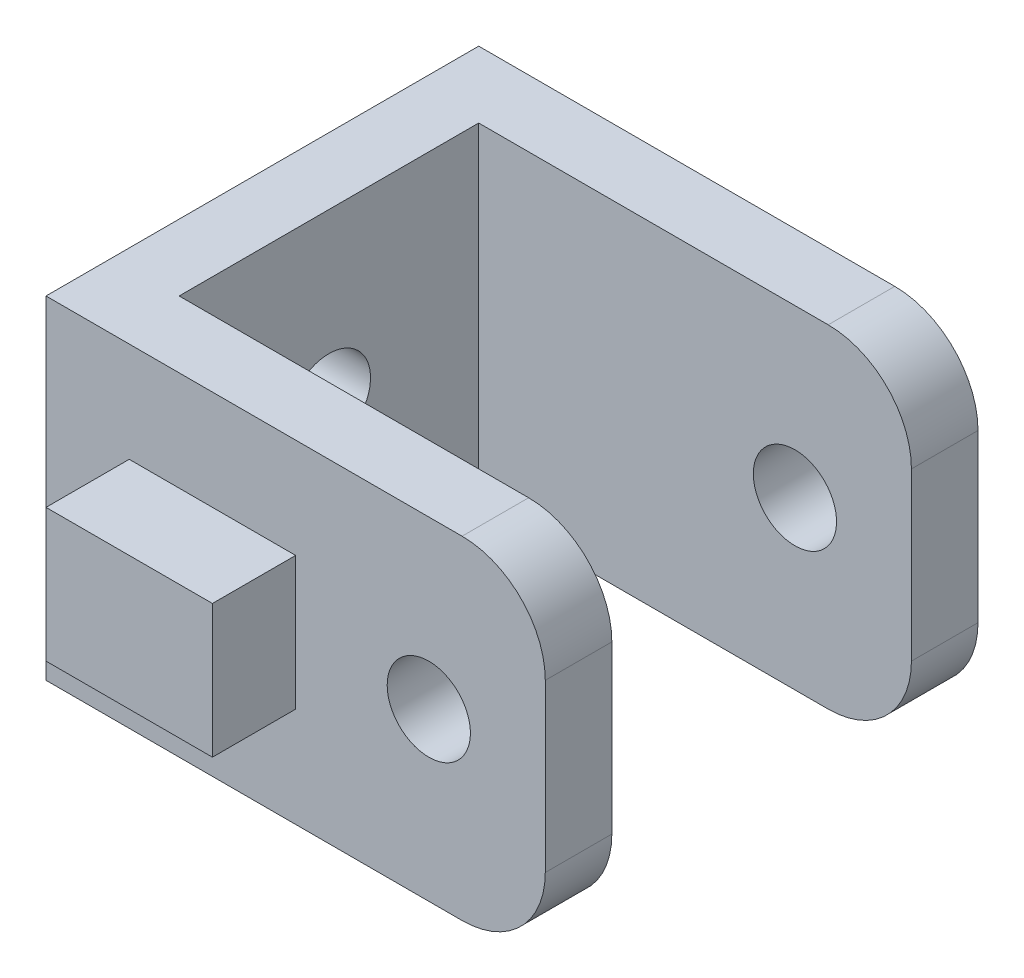
ISO-10303-21;
HEADER;
FILE_DESCRIPTION(('STEP AP214'),'2;1');
FILE_NAME('part.step','',(''),(''),'','','');
FILE_SCHEMA(('AUTOMOTIVE_DESIGN { 1 0 10303 214 1 1 1 1 }'));
ENDSEC;
DATA;
#1=APPLICATION_CONTEXT('core data for automotive mechanical design processes');
#2=APPLICATION_PROTOCOL_DEFINITION('international standard','automotive_design',2000,#1);
#3=PRODUCT_CONTEXT('',#1,'mechanical');
#4=PRODUCT('Part','Part','',(#3));
#5=PRODUCT_RELATED_PRODUCT_CATEGORY('part','',(#4));
#6=PRODUCT_DEFINITION_FORMATION('','',#4);
#7=PRODUCT_DEFINITION_CONTEXT('part definition',#1,'design');
#8=PRODUCT_DEFINITION('design','',#6,#7);
#9=PRODUCT_DEFINITION_SHAPE('','',#8);
#10=(LENGTH_UNIT() NAMED_UNIT(*) SI_UNIT(.MILLI.,.METRE.));
#11=(NAMED_UNIT(*) PLANE_ANGLE_UNIT() SI_UNIT($,.RADIAN.));
#12=(NAMED_UNIT(*) SI_UNIT($,.STERADIAN.) SOLID_ANGLE_UNIT());
#13=UNCERTAINTY_MEASURE_WITH_UNIT(LENGTH_MEASURE(1.E-05),#10,'distance_accuracy_value','');
#14=(GEOMETRIC_REPRESENTATION_CONTEXT(3) GLOBAL_UNCERTAINTY_ASSIGNED_CONTEXT((#13)) GLOBAL_UNIT_ASSIGNED_CONTEXT((#10,
#11,#12)) REPRESENTATION_CONTEXT('',''));
#15=CARTESIAN_POINT('',(0.,0.,0.));
#16=DIRECTION('',(0.,0.,1.));
#17=DIRECTION('',(1.,0.,0.));
#18=AXIS2_PLACEMENT_3D('',#15,#16,#17);
#19=CARTESIAN_POINT('',(0.,10.,-13.));
#20=DIRECTION('',(0.,0.,-1.));
#21=DIRECTION('',(-1.,0.,0.));
#22=AXIS2_PLACEMENT_3D('',#19,#20,#21);
#23=PLANE('',#22);
#24=CARTESIAN_POINT('',(23.,0.,-13.));
#25=DIRECTION('',(0.,0.,-1.));
#26=DIRECTION('',(-1.,0.,0.));
#27=AXIS2_PLACEMENT_3D('',#24,#25,#26);
#28=CIRCLE('',#27,2.5);
#29=CARTESIAN_POINT('',(20.5,0.,-13.));
#30=VERTEX_POINT('',#29);
#31=EDGE_CURVE('E200',#30,#30,#28,.F.);
#32=ORIENTED_EDGE('',*,*,#31,.T.);
#33=EDGE_LOOP('',(#32));
#34=FACE_BOUND('',#33,.T.);
#35=DIRECTION('',(0.,-1.,0.));
#36=VECTOR('',#35,1.);
#37=CARTESIAN_POINT('',(30.,10.,-13.));
#38=LINE('',#37,#36);
#39=CARTESIAN_POINT('',(30.,5.,-13.));
#40=VERTEX_POINT('',#39);
#41=CARTESIAN_POINT('',(30.,-5.,-13.));
#42=VERTEX_POINT('',#41);
#43=EDGE_CURVE('E286',#40,#42,#38,.T.);
#44=ORIENTED_EDGE('',*,*,#43,.T.);
#45=CARTESIAN_POINT('',(25.,-5.,-13.));
#46=DIRECTION('',(0.,0.,-1.));
#47=DIRECTION('',(-1.,0.,0.));
#48=AXIS2_PLACEMENT_3D('',#45,#46,#47);
#49=CIRCLE('',#48,5.);
#50=CARTESIAN_POINT('',(25.,-10.,-13.));
#51=VERTEX_POINT('',#50);
#52=EDGE_CURVE('E307',#42,#51,#49,.T.);
#53=ORIENTED_EDGE('',*,*,#52,.T.);
#54=DIRECTION('',(1.,0.,0.));
#55=VECTOR('',#54,1.);
#56=CARTESIAN_POINT('',(0.,-10.,-13.));
#57=LINE('',#56,#55);
#58=CARTESIAN_POINT('',(0.,-10.,-13.));
#59=VERTEX_POINT('',#58);
#60=EDGE_CURVE('E272',#59,#51,#57,.T.);
#61=ORIENTED_EDGE('',*,*,#60,.F.);
#62=DIRECTION('',(0.,-1.,0.));
#63=VECTOR('',#62,1.);
#64=CARTESIAN_POINT('',(0.,10.,-13.));
#65=LINE('',#64,#63);
#66=CARTESIAN_POINT('',(0.,10.,-13.));
#67=VERTEX_POINT('',#66);
#68=EDGE_CURVE('E284',#67,#59,#65,.T.);
#69=ORIENTED_EDGE('',*,*,#68,.F.);
#70=DIRECTION('',(1.,0.,0.));
#71=VECTOR('',#70,1.);
#72=CARTESIAN_POINT('',(0.,10.,-13.));
#73=LINE('',#72,#71);
#74=CARTESIAN_POINT('',(25.,10.,-13.));
#75=VERTEX_POINT('',#74);
#76=EDGE_CURVE('E256',#67,#75,#73,.T.);
#77=ORIENTED_EDGE('',*,*,#76,.T.);
#78=CARTESIAN_POINT('',(25.,5.,-13.));
#79=DIRECTION('',(0.,0.,-1.));
#80=DIRECTION('',(-1.,0.,0.));
#81=AXIS2_PLACEMENT_3D('',#78,#79,#80);
#82=CIRCLE('',#81,5.);
#83=EDGE_CURVE('E305',#75,#40,#82,.T.);
#84=ORIENTED_EDGE('',*,*,#83,.T.);
#85=EDGE_LOOP('',(#44,#53,#61,#69,#77,#84));
#86=FACE_BOUND('',#85,.T.);
#87=DIRECTION('',(1.,0.,0.));
#88=VECTOR('',#87,1.);
#89=CARTESIAN_POINT('',(15.,4.,-13.));
#90=LINE('',#89,#88);
#91=CARTESIAN_POINT('',(5.,4.,-13.));
#92=VERTEX_POINT('',#91);
#93=CARTESIAN_POINT('',(15.,4.,-13.));
#94=VERTEX_POINT('',#93);
#95=EDGE_CURVE('E619',#92,#94,#90,.T.);
#96=ORIENTED_EDGE('',*,*,#95,.F.);
#97=DIRECTION('',(0.,1.,0.));
#98=VECTOR('',#97,1.);
#99=CARTESIAN_POINT('',(5.,4.,-13.));
#100=LINE('',#99,#98);
#101=CARTESIAN_POINT('',(5.,-4.,-13.));
#102=VERTEX_POINT('',#101);
#103=EDGE_CURVE('E198',#102,#92,#100,.T.);
#104=ORIENTED_EDGE('',*,*,#103,.F.);
#105=DIRECTION('',(-1.,0.,0.));
#106=VECTOR('',#105,1.);
#107=CARTESIAN_POINT('',(15.,-4.,-13.));
#108=LINE('',#107,#106);
#109=CARTESIAN_POINT('',(15.,-4.,-13.));
#110=VERTEX_POINT('',#109);
#111=EDGE_CURVE('E194',#110,#102,#108,.T.);
#112=ORIENTED_EDGE('',*,*,#111,.F.);
#113=DIRECTION('',(0.,-1.,0.));
#114=VECTOR('',#113,1.);
#115=CARTESIAN_POINT('',(15.,4.,-13.));
#116=LINE('',#115,#114);
#117=EDGE_CURVE('E627',#94,#110,#116,.T.);
#118=ORIENTED_EDGE('',*,*,#117,.F.);
#119=EDGE_LOOP('',(#96,#104,#112,#118));
#120=FACE_BOUND('',#119,.T.);
#121=ADVANCED_FACE('F38',(#34,#86,#120),#23,.T.);
#122=CARTESIAN_POINT('',(0.,10.,13.));
#123=DIRECTION('',(0.,0.,-1.));
#124=DIRECTION('',(-1.,0.,0.));
#125=AXIS2_PLACEMENT_3D('',#122,#123,#124);
#126=PLANE('',#125);
#127=CARTESIAN_POINT('',(23.,0.,13.));
#128=DIRECTION('',(0.,0.,-1.));
#129=DIRECTION('',(-1.,0.,0.));
#130=AXIS2_PLACEMENT_3D('',#127,#128,#129);
#131=CIRCLE('',#130,2.5);
#132=CARTESIAN_POINT('',(20.5,0.,13.));
#133=VERTEX_POINT('',#132);
#134=EDGE_CURVE('E213',#133,#133,#131,.T.);
#135=ORIENTED_EDGE('',*,*,#134,.T.);
#136=EDGE_LOOP('',(#135));
#137=FACE_BOUND('',#136,.T.);
#138=DIRECTION('',(1.,0.,0.));
#139=VECTOR('',#138,1.);
#140=CARTESIAN_POINT('',(0.,-10.,13.));
#141=LINE('',#140,#139);
#142=CARTESIAN_POINT('',(0.,-10.,13.));
#143=VERTEX_POINT('',#142);
#144=CARTESIAN_POINT('',(25.,-10.,13.));
#145=VERTEX_POINT('',#144);
#146=EDGE_CURVE('E251',#143,#145,#141,.T.);
#147=ORIENTED_EDGE('',*,*,#146,.T.);
#148=CARTESIAN_POINT('',(25.,-5.,13.));
#149=DIRECTION('',(0.,0.,-1.));
#150=DIRECTION('',(-1.,0.,0.));
#151=AXIS2_PLACEMENT_3D('',#148,#149,#150);
#152=CIRCLE('',#151,5.);
#153=CARTESIAN_POINT('',(30.,-5.,13.));
#154=VERTEX_POINT('',#153);
#155=EDGE_CURVE('E320',#145,#154,#152,.F.);
#156=ORIENTED_EDGE('',*,*,#155,.T.);
#157=DIRECTION('',(0.,-1.,0.));
#158=VECTOR('',#157,1.);
#159=CARTESIAN_POINT('',(30.,10.,13.));
#160=LINE('',#159,#158);
#161=CARTESIAN_POINT('',(30.,5.,13.));
#162=VERTEX_POINT('',#161);
#163=EDGE_CURVE('E264',#162,#154,#160,.T.);
#164=ORIENTED_EDGE('',*,*,#163,.F.);
#165=CARTESIAN_POINT('',(25.,5.,13.));
#166=DIRECTION('',(0.,0.,-1.));
#167=DIRECTION('',(-1.,0.,0.));
#168=AXIS2_PLACEMENT_3D('',#165,#166,#167);
#169=CIRCLE('',#168,5.);
#170=CARTESIAN_POINT('',(25.,10.,13.));
#171=VERTEX_POINT('',#170);
#172=EDGE_CURVE('E318',#162,#171,#169,.F.);
#173=ORIENTED_EDGE('',*,*,#172,.T.);
#174=DIRECTION('',(1.,0.,0.));
#175=VECTOR('',#174,1.);
#176=CARTESIAN_POINT('',(0.,10.,13.));
#177=LINE('',#176,#175);
#178=CARTESIAN_POINT('',(0.,10.,13.));
#179=VERTEX_POINT('',#178);
#180=EDGE_CURVE('E261',#179,#171,#177,.T.);
#181=ORIENTED_EDGE('',*,*,#180,.F.);
#182=DIRECTION('',(0.,-1.,0.));
#183=VECTOR('',#182,1.);
#184=CARTESIAN_POINT('',(0.,10.,13.));
#185=LINE('',#184,#183);
#186=EDGE_CURVE('E281',#179,#143,#185,.T.);
#187=ORIENTED_EDGE('',*,*,#186,.T.);
#188=EDGE_LOOP('',(#147,#156,#164,#173,#181,#187));
#189=FACE_BOUND('',#188,.T.);
#190=DIRECTION('',(0.,1.,0.));
#191=VECTOR('',#190,1.);
#192=CARTESIAN_POINT('',(15.,4.,13.));
#193=LINE('',#192,#191);
#194=CARTESIAN_POINT('',(15.,-4.,13.));
#195=VERTEX_POINT('',#194);
#196=CARTESIAN_POINT('',(15.,4.,13.));
#197=VERTEX_POINT('',#196);
#198=EDGE_CURVE('E61',#195,#197,#193,.T.);
#199=ORIENTED_EDGE('',*,*,#198,.F.);
#200=DIRECTION('',(1.,0.,0.));
#201=VECTOR('',#200,1.);
#202=CARTESIAN_POINT('',(5.,-4.,13.));
#203=LINE('',#202,#201);
#204=CARTESIAN_POINT('',(5.,-4.,13.));
#205=VERTEX_POINT('',#204);
#206=EDGE_CURVE('E220',#205,#195,#203,.T.);
#207=ORIENTED_EDGE('',*,*,#206,.F.);
#208=DIRECTION('',(0.,-1.,0.));
#209=VECTOR('',#208,1.);
#210=CARTESIAN_POINT('',(5.,4.,13.));
#211=LINE('',#210,#209);
#212=CARTESIAN_POINT('',(5.,4.,13.));
#213=VERTEX_POINT('',#212);
#214=EDGE_CURVE('E231',#213,#205,#211,.T.);
#215=ORIENTED_EDGE('',*,*,#214,.F.);
#216=DIRECTION('',(-1.,0.,0.));
#217=VECTOR('',#216,1.);
#218=CARTESIAN_POINT('',(5.,4.,13.));
#219=LINE('',#218,#217);
#220=EDGE_CURVE('E228',#197,#213,#219,.T.);
#221=ORIENTED_EDGE('',*,*,#220,.F.);
#222=EDGE_LOOP('',(#199,#207,#215,#221));
#223=FACE_BOUND('',#222,.T.);
#224=ADVANCED_FACE('F348',(#137,#189,#223),#126,.F.);
#225=CARTESIAN_POINT('',(30.,10.,0.));
#226=DIRECTION('',(1.,0.,0.));
#227=DIRECTION('',(0.,0.,-1.));
#228=AXIS2_PLACEMENT_3D('',#225,#226,#227);
#229=PLANE('',#228);
#230=ORIENTED_EDGE('',*,*,#163,.T.);
#231=DIRECTION('',(0.,0.,1.));
#232=VECTOR('',#231,1.);
#233=CARTESIAN_POINT('',(30.,-5.,9.));
#234=LINE('',#233,#232);
#235=CARTESIAN_POINT('',(30.,-5.,9.));
#236=VERTEX_POINT('',#235);
#237=EDGE_CURVE('E325',#154,#236,#234,.F.);
#238=ORIENTED_EDGE('',*,*,#237,.T.);
#239=DIRECTION('',(0.,-1.,0.));
#240=VECTOR('',#239,1.);
#241=CARTESIAN_POINT('',(30.,10.,9.));
#242=LINE('',#241,#240);
#243=CARTESIAN_POINT('',(30.,5.,9.));
#244=VERTEX_POINT('',#243);
#245=EDGE_CURVE('E297',#244,#236,#242,.T.);
#246=ORIENTED_EDGE('',*,*,#245,.F.);
#247=DIRECTION('',(0.,0.,1.));
#248=VECTOR('',#247,1.);
#249=CARTESIAN_POINT('',(30.,5.,0.));
#250=LINE('',#249,#248);
#251=EDGE_CURVE('E322',#244,#162,#250,.T.);
#252=ORIENTED_EDGE('',*,*,#251,.T.);
#253=EDGE_LOOP('',(#230,#238,#246,#252));
#254=FACE_BOUND('',#253,.T.);
#255=ADVANCED_FACE('F345',(#254),#229,.T.);
#256=CARTESIAN_POINT('',(0.,10.,9.));
#257=DIRECTION('',(0.,0.,-1.));
#258=DIRECTION('',(-1.,0.,0.));
#259=AXIS2_PLACEMENT_3D('',#256,#257,#258);
#260=PLANE('',#259);
#261=CARTESIAN_POINT('',(23.,0.,9.));
#262=DIRECTION('',(0.,0.,-1.));
#263=DIRECTION('',(-1.,0.,0.));
#264=AXIS2_PLACEMENT_3D('',#261,#262,#263);
#265=CIRCLE('',#264,2.5);
#266=CARTESIAN_POINT('',(20.5,0.,9.));
#267=VERTEX_POINT('',#266);
#268=EDGE_CURVE('E210',#267,#267,#265,.T.);
#269=ORIENTED_EDGE('',*,*,#268,.F.);
#270=EDGE_LOOP('',(#269));
#271=FACE_BOUND('',#270,.T.);
#272=ORIENTED_EDGE('',*,*,#245,.T.);
#273=CARTESIAN_POINT('',(25.,-5.,9.));
#274=DIRECTION('',(0.,0.,-1.));
#275=DIRECTION('',(-1.,0.,0.));
#276=AXIS2_PLACEMENT_3D('',#273,#274,#275);
#277=CIRCLE('',#276,5.);
#278=CARTESIAN_POINT('',(25.,-10.,9.));
#279=VERTEX_POINT('',#278);
#280=EDGE_CURVE('E329',#236,#279,#277,.T.);
#281=ORIENTED_EDGE('',*,*,#280,.T.);
#282=DIRECTION('',(1.,0.,0.));
#283=VECTOR('',#282,1.);
#284=CARTESIAN_POINT('',(0.,-10.,9.));
#285=LINE('',#284,#283);
#286=CARTESIAN_POINT('',(4.,-10.,9.));
#287=VERTEX_POINT('',#286);
#288=EDGE_CURVE('E246',#287,#279,#285,.T.);
#289=ORIENTED_EDGE('',*,*,#288,.F.);
#290=DIRECTION('',(0.,-1.,0.));
#291=VECTOR('',#290,1.);
#292=CARTESIAN_POINT('',(4.,10.,9.));
#293=LINE('',#292,#291);
#294=CARTESIAN_POINT('',(4.,10.,9.));
#295=VERTEX_POINT('',#294);
#296=EDGE_CURVE('E295',#295,#287,#293,.T.);
#297=ORIENTED_EDGE('',*,*,#296,.F.);
#298=DIRECTION('',(1.,0.,0.));
#299=VECTOR('',#298,1.);
#300=CARTESIAN_POINT('',(0.,10.,9.));
#301=LINE('',#300,#299);
#302=CARTESIAN_POINT('',(25.,10.,9.));
#303=VERTEX_POINT('',#302);
#304=EDGE_CURVE('E247',#295,#303,#301,.T.);
#305=ORIENTED_EDGE('',*,*,#304,.T.);
#306=CARTESIAN_POINT('',(25.,5.,9.));
#307=DIRECTION('',(0.,0.,-1.));
#308=DIRECTION('',(-1.,0.,0.));
#309=AXIS2_PLACEMENT_3D('',#306,#307,#308);
#310=CIRCLE('',#309,5.);
#311=EDGE_CURVE('E327',#303,#244,#310,.T.);
#312=ORIENTED_EDGE('',*,*,#311,.T.);
#313=EDGE_LOOP('',(#272,#281,#289,#297,#305,#312));
#314=FACE_BOUND('',#313,.T.);
#315=ADVANCED_FACE('F338',(#271,#314),#260,.T.);
#316=CARTESIAN_POINT('',(4.,10.,0.));
#317=DIRECTION('',(-1.,0.,0.));
#318=DIRECTION('',(0.,0.,1.));
#319=AXIS2_PLACEMENT_3D('',#316,#317,#318);
#320=PLANE('',#319);
#321=CARTESIAN_POINT('',(4.,0.,0.));
#322=DIRECTION('',(-1.,0.,0.));
#323=DIRECTION('',(0.,0.,1.));
#324=AXIS2_PLACEMENT_3D('',#321,#322,#323);
#325=CIRCLE('',#324,2.5);
#326=CARTESIAN_POINT('',(4.,0.,2.5));
#327=VERTEX_POINT('',#326);
#328=EDGE_CURVE('E617',#327,#327,#325,.T.);
#329=ORIENTED_EDGE('',*,*,#328,.T.);
#330=EDGE_LOOP('',(#329));
#331=FACE_BOUND('',#330,.T.);
#332=DIRECTION('',(0.,0.,-1.));
#333=VECTOR('',#332,1.);
#334=CARTESIAN_POINT('',(4.,-10.,0.));
#335=LINE('',#334,#333);
#336=CARTESIAN_POINT('',(4.,-10.,-9.));
#337=VERTEX_POINT('',#336);
#338=EDGE_CURVE('E267',#287,#337,#335,.T.);
#339=ORIENTED_EDGE('',*,*,#338,.T.);
#340=DIRECTION('',(0.,-1.,0.));
#341=VECTOR('',#340,1.);
#342=CARTESIAN_POINT('',(4.,10.,-9.));
#343=LINE('',#342,#341);
#344=CARTESIAN_POINT('',(4.,10.,-9.));
#345=VERTEX_POINT('',#344);
#346=EDGE_CURVE('E292',#345,#337,#343,.T.);
#347=ORIENTED_EDGE('',*,*,#346,.F.);
#348=DIRECTION('',(0.,0.,-1.));
#349=VECTOR('',#348,1.);
#350=CARTESIAN_POINT('',(4.,10.,0.));
#351=LINE('',#350,#349);
#352=EDGE_CURVE('E250',#295,#345,#351,.T.);
#353=ORIENTED_EDGE('',*,*,#352,.F.);
#354=ORIENTED_EDGE('',*,*,#296,.T.);
#355=EDGE_LOOP('',(#339,#347,#353,#354));
#356=FACE_BOUND('',#355,.T.);
#357=ADVANCED_FACE('F361',(#331,#356),#320,.F.);
#358=CARTESIAN_POINT('',(0.,10.,-9.));
#359=DIRECTION('',(0.,0.,-1.));
#360=DIRECTION('',(-1.,0.,0.));
#361=AXIS2_PLACEMENT_3D('',#358,#359,#360);
#362=PLANE('',#361);
#363=CARTESIAN_POINT('',(23.,0.,-9.));
#364=DIRECTION('',(0.,0.,-1.));
#365=DIRECTION('',(-1.,0.,0.));
#366=AXIS2_PLACEMENT_3D('',#363,#364,#365);
#367=CIRCLE('',#366,2.5);
#368=CARTESIAN_POINT('',(20.5,0.,-9.));
#369=VERTEX_POINT('',#368);
#370=EDGE_CURVE('E203',#369,#369,#367,.T.);
#371=ORIENTED_EDGE('',*,*,#370,.T.);
#372=EDGE_LOOP('',(#371));
#373=FACE_BOUND('',#372,.T.);
#374=DIRECTION('',(1.,0.,0.));
#375=VECTOR('',#374,1.);
#376=CARTESIAN_POINT('',(0.,-10.,-9.));
#377=LINE('',#376,#375);
#378=CARTESIAN_POINT('',(25.,-10.,-9.));
#379=VERTEX_POINT('',#378);
#380=EDGE_CURVE('E269',#337,#379,#377,.T.);
#381=ORIENTED_EDGE('',*,*,#380,.T.);
#382=CARTESIAN_POINT('',(25.,-5.,-9.));
#383=DIRECTION('',(0.,0.,-1.));
#384=DIRECTION('',(-1.,0.,0.));
#385=AXIS2_PLACEMENT_3D('',#382,#383,#384);
#386=CIRCLE('',#385,5.);
#387=CARTESIAN_POINT('',(30.,-5.,-9.));
#388=VERTEX_POINT('',#387);
#389=EDGE_CURVE('E316',#379,#388,#386,.F.);
#390=ORIENTED_EDGE('',*,*,#389,.T.);
#391=DIRECTION('',(0.,-1.,0.));
#392=VECTOR('',#391,1.);
#393=CARTESIAN_POINT('',(30.,10.,-9.));
#394=LINE('',#393,#392);
#395=CARTESIAN_POINT('',(30.,5.,-9.));
#396=VERTEX_POINT('',#395);
#397=EDGE_CURVE('E289',#396,#388,#394,.T.);
#398=ORIENTED_EDGE('',*,*,#397,.F.);
#399=CARTESIAN_POINT('',(25.,5.,-9.));
#400=DIRECTION('',(0.,0.,-1.));
#401=DIRECTION('',(-1.,0.,0.));
#402=AXIS2_PLACEMENT_3D('',#399,#400,#401);
#403=CIRCLE('',#402,5.);
#404=CARTESIAN_POINT('',(25.,10.,-9.));
#405=VERTEX_POINT('',#404);
#406=EDGE_CURVE('E314',#396,#405,#403,.F.);
#407=ORIENTED_EDGE('',*,*,#406,.T.);
#408=DIRECTION('',(1.,0.,0.));
#409=VECTOR('',#408,1.);
#410=CARTESIAN_POINT('',(0.,10.,-9.));
#411=LINE('',#410,#409);
#412=EDGE_CURVE('E253',#345,#405,#411,.T.);
#413=ORIENTED_EDGE('',*,*,#412,.F.);
#414=ORIENTED_EDGE('',*,*,#346,.T.);
#415=EDGE_LOOP('',(#381,#390,#398,#407,#413,#414));
#416=FACE_BOUND('',#415,.T.);
#417=ADVANCED_FACE('F364',(#373,#416),#362,.F.);
#418=CARTESIAN_POINT('',(30.,10.,0.));
#419=DIRECTION('',(-1.,0.,0.));
#420=DIRECTION('',(0.,0.,1.));
#421=AXIS2_PLACEMENT_3D('',#418,#419,#420);
#422=PLANE('',#421);
#423=ORIENTED_EDGE('',*,*,#397,.T.);
#424=DIRECTION('',(0.,0.,-1.));
#425=VECTOR('',#424,1.);
#426=CARTESIAN_POINT('',(30.,-5.,0.));
#427=LINE('',#426,#425);
#428=EDGE_CURVE('E302',#388,#42,#427,.T.);
#429=ORIENTED_EDGE('',*,*,#428,.T.);
#430=ORIENTED_EDGE('',*,*,#43,.F.);
#431=DIRECTION('',(0.,0.,-1.));
#432=VECTOR('',#431,1.);
#433=CARTESIAN_POINT('',(30.,5.,-9.));
#434=LINE('',#433,#432);
#435=EDGE_CURVE('E300',#40,#396,#434,.F.);
#436=ORIENTED_EDGE('',*,*,#435,.T.);
#437=EDGE_LOOP('',(#423,#429,#430,#436));
#438=FACE_BOUND('',#437,.T.);
#439=ADVANCED_FACE('F377',(#438),#422,.F.);
#440=CARTESIAN_POINT('',(0.,10.,0.));
#441=DIRECTION('',(1.,0.,0.));
#442=DIRECTION('',(0.,0.,-1.));
#443=AXIS2_PLACEMENT_3D('',#440,#441,#442);
#444=PLANE('',#443);
#445=CARTESIAN_POINT('',(0.,0.,0.));
#446=DIRECTION('',(-1.,0.,0.));
#447=DIRECTION('',(0.,0.,1.));
#448=AXIS2_PLACEMENT_3D('',#445,#446,#447);
#449=CIRCLE('',#448,2.5);
#450=CARTESIAN_POINT('',(0.,0.,2.5));
#451=VERTEX_POINT('',#450);
#452=EDGE_CURVE('E614',#451,#451,#449,.T.);
#453=ORIENTED_EDGE('',*,*,#452,.F.);
#454=EDGE_LOOP('',(#453));
#455=FACE_BOUND('',#454,.T.);
#456=DIRECTION('',(0.,0.,1.));
#457=VECTOR('',#456,1.);
#458=CARTESIAN_POINT('',(0.,-10.,0.));
#459=LINE('',#458,#457);
#460=EDGE_CURVE('E275',#59,#143,#459,.T.);
#461=ORIENTED_EDGE('',*,*,#460,.T.);
#462=ORIENTED_EDGE('',*,*,#186,.F.);
#463=DIRECTION('',(0.,0.,1.));
#464=VECTOR('',#463,1.);
#465=CARTESIAN_POINT('',(0.,10.,0.));
#466=LINE('',#465,#464);
#467=EDGE_CURVE('E259',#67,#179,#466,.T.);
#468=ORIENTED_EDGE('',*,*,#467,.F.);
#469=ORIENTED_EDGE('',*,*,#68,.T.);
#470=EDGE_LOOP('',(#461,#462,#468,#469));
#471=FACE_BOUND('',#470,.T.);
#472=ADVANCED_FACE('F385',(#455,#471),#444,.F.);
#473=CARTESIAN_POINT('',(0.,10.,0.));
#474=DIRECTION('',(0.,1.,0.));
#475=DIRECTION('',(0.,0.,1.));
#476=AXIS2_PLACEMENT_3D('',#473,#474,#475);
#477=PLANE('',#476);
#478=ORIENTED_EDGE('',*,*,#412,.T.);
#479=DIRECTION('',(0.,0.,-1.));
#480=VECTOR('',#479,1.);
#481=CARTESIAN_POINT('',(25.,10.,-13.));
#482=LINE('',#481,#480);
#483=EDGE_CURVE('E11',#405,#75,#482,.T.);
#484=ORIENTED_EDGE('',*,*,#483,.T.);
#485=ORIENTED_EDGE('',*,*,#76,.F.);
#486=ORIENTED_EDGE('',*,*,#467,.T.);
#487=ORIENTED_EDGE('',*,*,#180,.T.);
#488=DIRECTION('',(0.,0.,1.));
#489=VECTOR('',#488,1.);
#490=CARTESIAN_POINT('',(25.,10.,0.));
#491=LINE('',#490,#489);
#492=EDGE_CURVE('E46',#171,#303,#491,.F.);
#493=ORIENTED_EDGE('',*,*,#492,.T.);
#494=ORIENTED_EDGE('',*,*,#304,.F.);
#495=ORIENTED_EDGE('',*,*,#352,.T.);
#496=EDGE_LOOP('',(#478,#484,#485,#486,#487,#493,#494,#495));
#497=FACE_BOUND('',#496,.T.);
#498=ADVANCED_FACE('F333',(#497),#477,.T.);
#499=CARTESIAN_POINT('',(0.,-10.,0.));
#500=DIRECTION('',(0.,1.,0.));
#501=DIRECTION('',(0.,0.,1.));
#502=AXIS2_PLACEMENT_3D('',#499,#500,#501);
#503=PLANE('',#502);
#504=ORIENTED_EDGE('',*,*,#60,.T.);
#505=DIRECTION('',(0.,0.,-1.));
#506=VECTOR('',#505,1.);
#507=CARTESIAN_POINT('',(25.,-10.,0.));
#508=LINE('',#507,#506);
#509=EDGE_CURVE('E312',#51,#379,#508,.F.);
#510=ORIENTED_EDGE('',*,*,#509,.T.);
#511=ORIENTED_EDGE('',*,*,#380,.F.);
#512=ORIENTED_EDGE('',*,*,#338,.F.);
#513=ORIENTED_EDGE('',*,*,#288,.T.);
#514=DIRECTION('',(0.,0.,1.));
#515=VECTOR('',#514,1.);
#516=CARTESIAN_POINT('',(25.,-10.,13.));
#517=LINE('',#516,#515);
#518=EDGE_CURVE('E309',#279,#145,#517,.T.);
#519=ORIENTED_EDGE('',*,*,#518,.T.);
#520=ORIENTED_EDGE('',*,*,#146,.F.);
#521=ORIENTED_EDGE('',*,*,#460,.F.);
#522=EDGE_LOOP('',(#504,#510,#511,#512,#513,#519,#520,#521));
#523=FACE_BOUND('',#522,.T.);
#524=ADVANCED_FACE('F355',(#523),#503,.F.);
#525=CARTESIAN_POINT('',(25.,-5.,0.));
#526=DIRECTION('',(0.,0.,-1.));
#527=DIRECTION('',(-1.,0.,0.));
#528=AXIS2_PLACEMENT_3D('',#525,#526,#527);
#529=CYLINDRICAL_SURFACE('',#528,5.);
#530=ORIENTED_EDGE('',*,*,#389,.F.);
#531=ORIENTED_EDGE('',*,*,#509,.F.);
#532=ORIENTED_EDGE('',*,*,#52,.F.);
#533=ORIENTED_EDGE('',*,*,#428,.F.);
#534=EDGE_LOOP('',(#530,#531,#532,#533));
#535=FACE_BOUND('',#534,.T.);
#536=ADVANCED_FACE('F380',(#535),#529,.T.);
#537=CARTESIAN_POINT('',(25.,-5.,0.));
#538=DIRECTION('',(0.,0.,-1.));
#539=DIRECTION('',(-1.,0.,0.));
#540=AXIS2_PLACEMENT_3D('',#537,#538,#539);
#541=CYLINDRICAL_SURFACE('',#540,5.);
#542=ORIENTED_EDGE('',*,*,#280,.F.);
#543=ORIENTED_EDGE('',*,*,#237,.F.);
#544=ORIENTED_EDGE('',*,*,#155,.F.);
#545=ORIENTED_EDGE('',*,*,#518,.F.);
#546=EDGE_LOOP('',(#542,#543,#544,#545));
#547=FACE_BOUND('',#546,.T.);
#548=ADVANCED_FACE('F353',(#547),#541,.T.);
#549=CARTESIAN_POINT('',(25.,5.,0.));
#550=DIRECTION('',(0.,0.,1.));
#551=DIRECTION('',(1.,0.,0.));
#552=AXIS2_PLACEMENT_3D('',#549,#550,#551);
#553=CYLINDRICAL_SURFACE('',#552,5.);
#554=ORIENTED_EDGE('',*,*,#406,.F.);
#555=ORIENTED_EDGE('',*,*,#435,.F.);
#556=ORIENTED_EDGE('',*,*,#83,.F.);
#557=ORIENTED_EDGE('',*,*,#483,.F.);
#558=EDGE_LOOP('',(#554,#555,#556,#557));
#559=FACE_BOUND('',#558,.T.);
#560=ADVANCED_FACE('F371',(#559),#553,.T.);
#561=CARTESIAN_POINT('',(25.,5.,0.));
#562=DIRECTION('',(0.,0.,1.));
#563=DIRECTION('',(1.,0.,0.));
#564=AXIS2_PLACEMENT_3D('',#561,#562,#563);
#565=CYLINDRICAL_SURFACE('',#564,5.);
#566=ORIENTED_EDGE('',*,*,#311,.F.);
#567=ORIENTED_EDGE('',*,*,#492,.F.);
#568=ORIENTED_EDGE('',*,*,#172,.F.);
#569=ORIENTED_EDGE('',*,*,#251,.F.);
#570=EDGE_LOOP('',(#566,#567,#568,#569));
#571=FACE_BOUND('',#570,.T.);
#572=ADVANCED_FACE('F40',(#571),#565,.T.);
#573=CARTESIAN_POINT('',(15.,4.,18.));
#574=DIRECTION('',(-1.,0.,0.));
#575=DIRECTION('',(0.,-1.,0.));
#576=AXIS2_PLACEMENT_3D('',#573,#574,#575);
#577=PLANE('',#576);
#578=ORIENTED_EDGE('',*,*,#198,.T.);
#579=DIRECTION('',(0.,0.,-1.));
#580=VECTOR('',#579,1.);
#581=CARTESIAN_POINT('',(15.,4.,18.));
#582=LINE('',#581,#580);
#583=CARTESIAN_POINT('',(15.,4.,18.));
#584=VERTEX_POINT('',#583);
#585=EDGE_CURVE('E243',#584,#197,#582,.T.);
#586=ORIENTED_EDGE('',*,*,#585,.F.);
#587=DIRECTION('',(0.,1.,0.));
#588=VECTOR('',#587,1.);
#589=CARTESIAN_POINT('',(15.,4.,18.));
#590=LINE('',#589,#588);
#591=CARTESIAN_POINT('',(15.,-4.,18.));
#592=VERTEX_POINT('',#591);
#593=EDGE_CURVE('E216',#592,#584,#590,.T.);
#594=ORIENTED_EDGE('',*,*,#593,.F.);
#595=DIRECTION('',(0.,0.,-1.));
#596=VECTOR('',#595,1.);
#597=CARTESIAN_POINT('',(15.,-4.,18.));
#598=LINE('',#597,#596);
#599=EDGE_CURVE('E226',#592,#195,#598,.T.);
#600=ORIENTED_EDGE('',*,*,#599,.T.);
#601=EDGE_LOOP('',(#578,#586,#594,#600));
#602=FACE_BOUND('',#601,.T.);
#603=ADVANCED_FACE('F424',(#602),#577,.F.);
#604=CARTESIAN_POINT('',(5.,4.,18.));
#605=DIRECTION('',(0.,-1.,0.));
#606=DIRECTION('',(0.,0.,-1.));
#607=AXIS2_PLACEMENT_3D('',#604,#605,#606);
#608=PLANE('',#607);
#609=ORIENTED_EDGE('',*,*,#220,.T.);
#610=DIRECTION('',(0.,0.,-1.));
#611=VECTOR('',#610,1.);
#612=CARTESIAN_POINT('',(5.,4.,18.));
#613=LINE('',#612,#611);
#614=CARTESIAN_POINT('',(5.,4.,18.));
#615=VERTEX_POINT('',#614);
#616=EDGE_CURVE('E240',#615,#213,#613,.T.);
#617=ORIENTED_EDGE('',*,*,#616,.F.);
#618=DIRECTION('',(-1.,0.,0.));
#619=VECTOR('',#618,1.);
#620=CARTESIAN_POINT('',(5.,4.,18.));
#621=LINE('',#620,#619);
#622=EDGE_CURVE('E219',#584,#615,#621,.T.);
#623=ORIENTED_EDGE('',*,*,#622,.F.);
#624=ORIENTED_EDGE('',*,*,#585,.T.);
#625=EDGE_LOOP('',(#609,#617,#623,#624));
#626=FACE_BOUND('',#625,.T.);
#627=ADVANCED_FACE('F428',(#626),#608,.F.);
#628=CARTESIAN_POINT('',(5.,4.,18.));
#629=DIRECTION('',(1.,0.,0.));
#630=DIRECTION('',(0.,1.,0.));
#631=AXIS2_PLACEMENT_3D('',#628,#629,#630);
#632=PLANE('',#631);
#633=ORIENTED_EDGE('',*,*,#214,.T.);
#634=DIRECTION('',(0.,0.,-1.));
#635=VECTOR('',#634,1.);
#636=CARTESIAN_POINT('',(5.,-4.,18.));
#637=LINE('',#636,#635);
#638=CARTESIAN_POINT('',(5.,-4.,18.));
#639=VERTEX_POINT('',#638);
#640=EDGE_CURVE('E237',#639,#205,#637,.T.);
#641=ORIENTED_EDGE('',*,*,#640,.F.);
#642=DIRECTION('',(0.,-1.,0.));
#643=VECTOR('',#642,1.);
#644=CARTESIAN_POINT('',(5.,4.,18.));
#645=LINE('',#644,#643);
#646=EDGE_CURVE('E222',#615,#639,#645,.T.);
#647=ORIENTED_EDGE('',*,*,#646,.F.);
#648=ORIENTED_EDGE('',*,*,#616,.T.);
#649=EDGE_LOOP('',(#633,#641,#647,#648));
#650=FACE_BOUND('',#649,.T.);
#651=ADVANCED_FACE('F434',(#650),#632,.F.);
#652=CARTESIAN_POINT('',(5.,-4.,18.));
#653=DIRECTION('',(0.,1.,0.));
#654=DIRECTION('',(0.,0.,1.));
#655=AXIS2_PLACEMENT_3D('',#652,#653,#654);
#656=PLANE('',#655);
#657=ORIENTED_EDGE('',*,*,#206,.T.);
#658=ORIENTED_EDGE('',*,*,#599,.F.);
#659=DIRECTION('',(1.,0.,0.));
#660=VECTOR('',#659,1.);
#661=CARTESIAN_POINT('',(5.,-4.,18.));
#662=LINE('',#661,#660);
#663=EDGE_CURVE('E224',#639,#592,#662,.T.);
#664=ORIENTED_EDGE('',*,*,#663,.F.);
#665=ORIENTED_EDGE('',*,*,#640,.T.);
#666=EDGE_LOOP('',(#657,#658,#664,#665));
#667=FACE_BOUND('',#666,.T.);
#668=ADVANCED_FACE('F480',(#667),#656,.F.);
#669=CARTESIAN_POINT('',(0.,0.,18.));
#670=DIRECTION('',(0.,0.,1.));
#671=DIRECTION('',(1.,0.,0.));
#672=AXIS2_PLACEMENT_3D('',#669,#670,#671);
#673=PLANE('',#672);
#674=ORIENTED_EDGE('',*,*,#593,.T.);
#675=ORIENTED_EDGE('',*,*,#622,.T.);
#676=ORIENTED_EDGE('',*,*,#646,.T.);
#677=ORIENTED_EDGE('',*,*,#663,.T.);
#678=EDGE_LOOP('',(#674,#675,#676,#677));
#679=FACE_BOUND('',#678,.T.);
#680=ADVANCED_FACE('F489',(#679),#673,.T.);
#681=CARTESIAN_POINT('',(23.,0.,-20.0710678118655));
#682=DIRECTION('',(0.,0.,1.));
#683=DIRECTION('',(1.,0.,0.));
#684=AXIS2_PLACEMENT_3D('',#681,#682,#683);
#685=CYLINDRICAL_SURFACE('',#684,2.5);
#686=ORIENTED_EDGE('',*,*,#31,.F.);
#687=EDGE_LOOP('',(#686));
#688=FACE_BOUND('',#687,.T.);
#689=ORIENTED_EDGE('',*,*,#370,.F.);
#690=EDGE_LOOP('',(#689));
#691=FACE_BOUND('',#690,.T.);
#692=ADVANCED_FACE('F499',(#688,#691),#685,.F.);
#693=ORIENTED_EDGE('',*,*,#268,.T.);
#694=EDGE_LOOP('',(#693));
#695=FACE_BOUND('',#694,.T.);
#696=ORIENTED_EDGE('',*,*,#134,.F.);
#697=EDGE_LOOP('',(#696));
#698=FACE_BOUND('',#697,.T.);
#699=ADVANCED_FACE('F530',(#695,#698),#685,.F.);
#700=CARTESIAN_POINT('',(5.,4.,-18.));
#701=DIRECTION('',(1.,0.,0.));
#702=DIRECTION('',(0.,0.,-1.));
#703=AXIS2_PLACEMENT_3D('',#700,#701,#702);
#704=PLANE('',#703);
#705=ORIENTED_EDGE('',*,*,#103,.T.);
#706=DIRECTION('',(0.,0.,1.));
#707=VECTOR('',#706,1.);
#708=CARTESIAN_POINT('',(5.,4.,-18.));
#709=LINE('',#708,#707);
#710=CARTESIAN_POINT('',(5.,4.,-18.));
#711=VERTEX_POINT('',#710);
#712=EDGE_CURVE('E179',#711,#92,#709,.T.);
#713=ORIENTED_EDGE('',*,*,#712,.F.);
#714=DIRECTION('',(0.,1.,0.));
#715=VECTOR('',#714,1.);
#716=CARTESIAN_POINT('',(5.,4.,-18.));
#717=LINE('',#716,#715);
#718=CARTESIAN_POINT('',(5.,-4.,-18.));
#719=VERTEX_POINT('',#718);
#720=EDGE_CURVE('E186',#719,#711,#717,.T.);
#721=ORIENTED_EDGE('',*,*,#720,.F.);
#722=DIRECTION('',(0.,0.,1.));
#723=VECTOR('',#722,1.);
#724=CARTESIAN_POINT('',(5.,-4.,-18.));
#725=LINE('',#724,#723);
#726=EDGE_CURVE('E624',#719,#102,#725,.T.);
#727=ORIENTED_EDGE('',*,*,#726,.T.);
#728=EDGE_LOOP('',(#705,#713,#721,#727));
#729=FACE_BOUND('',#728,.T.);
#730=ADVANCED_FACE('F196',(#729),#704,.F.);
#731=CARTESIAN_POINT('',(15.,4.,-18.));
#732=DIRECTION('',(0.,-1.,0.));
#733=DIRECTION('',(1.,0.,0.));
#734=AXIS2_PLACEMENT_3D('',#731,#732,#733);
#735=PLANE('',#734);
#736=ORIENTED_EDGE('',*,*,#95,.T.);
#737=DIRECTION('',(0.,0.,1.));
#738=VECTOR('',#737,1.);
#739=CARTESIAN_POINT('',(15.,4.,-18.));
#740=LINE('',#739,#738);
#741=CARTESIAN_POINT('',(15.,4.,-18.));
#742=VERTEX_POINT('',#741);
#743=EDGE_CURVE('E182',#742,#94,#740,.T.);
#744=ORIENTED_EDGE('',*,*,#743,.F.);
#745=DIRECTION('',(1.,0.,0.));
#746=VECTOR('',#745,1.);
#747=CARTESIAN_POINT('',(15.,4.,-18.));
#748=LINE('',#747,#746);
#749=EDGE_CURVE('E175',#711,#742,#748,.T.);
#750=ORIENTED_EDGE('',*,*,#749,.F.);
#751=ORIENTED_EDGE('',*,*,#712,.T.);
#752=EDGE_LOOP('',(#736,#744,#750,#751));
#753=FACE_BOUND('',#752,.T.);
#754=ADVANCED_FACE('F177',(#753),#735,.F.);
#755=CARTESIAN_POINT('',(15.,4.,-18.));
#756=DIRECTION('',(-1.,0.,0.));
#757=DIRECTION('',(0.,-1.,0.));
#758=AXIS2_PLACEMENT_3D('',#755,#756,#757);
#759=PLANE('',#758);
#760=ORIENTED_EDGE('',*,*,#117,.T.);
#761=DIRECTION('',(0.,0.,1.));
#762=VECTOR('',#761,1.);
#763=CARTESIAN_POINT('',(15.,-4.,-18.));
#764=LINE('',#763,#762);
#765=CARTESIAN_POINT('',(15.,-4.,-18.));
#766=VERTEX_POINT('',#765);
#767=EDGE_CURVE('E53',#766,#110,#764,.T.);
#768=ORIENTED_EDGE('',*,*,#767,.F.);
#769=DIRECTION('',(0.,-1.,0.));
#770=VECTOR('',#769,1.);
#771=CARTESIAN_POINT('',(15.,4.,-18.));
#772=LINE('',#771,#770);
#773=EDGE_CURVE('E185',#742,#766,#772,.T.);
#774=ORIENTED_EDGE('',*,*,#773,.F.);
#775=ORIENTED_EDGE('',*,*,#743,.T.);
#776=EDGE_LOOP('',(#760,#768,#774,#775));
#777=FACE_BOUND('',#776,.T.);
#778=ADVANCED_FACE('F560',(#777),#759,.F.);
#779=CARTESIAN_POINT('',(15.,-4.,-18.));
#780=DIRECTION('',(0.,1.,0.));
#781=DIRECTION('',(-1.,0.,0.));
#782=AXIS2_PLACEMENT_3D('',#779,#780,#781);
#783=PLANE('',#782);
#784=ORIENTED_EDGE('',*,*,#111,.T.);
#785=ORIENTED_EDGE('',*,*,#726,.F.);
#786=DIRECTION('',(-1.,0.,0.));
#787=VECTOR('',#786,1.);
#788=CARTESIAN_POINT('',(15.,-4.,-18.));
#789=LINE('',#788,#787);
#790=EDGE_CURVE('E190',#766,#719,#789,.T.);
#791=ORIENTED_EDGE('',*,*,#790,.F.);
#792=ORIENTED_EDGE('',*,*,#767,.T.);
#793=EDGE_LOOP('',(#784,#785,#791,#792));
#794=FACE_BOUND('',#793,.T.);
#795=ADVANCED_FACE('F569',(#794),#783,.F.);
#796=CARTESIAN_POINT('',(0.,0.,-18.));
#797=DIRECTION('',(0.,0.,-1.));
#798=DIRECTION('',(-1.,0.,0.));
#799=AXIS2_PLACEMENT_3D('',#796,#797,#798);
#800=PLANE('',#799);
#801=ORIENTED_EDGE('',*,*,#720,.T.);
#802=ORIENTED_EDGE('',*,*,#749,.T.);
#803=ORIENTED_EDGE('',*,*,#773,.T.);
#804=ORIENTED_EDGE('',*,*,#790,.T.);
#805=EDGE_LOOP('',(#801,#802,#803,#804));
#806=FACE_BOUND('',#805,.T.);
#807=ADVANCED_FACE('F189',(#806),#800,.T.);
#808=CARTESIAN_POINT('',(5.,0.,0.));
#809=DIRECTION('',(-1.,0.,0.));
#810=DIRECTION('',(0.,0.,1.));
#811=AXIS2_PLACEMENT_3D('',#808,#809,#810);
#812=CYLINDRICAL_SURFACE('',#811,2.5);
#813=ORIENTED_EDGE('',*,*,#452,.T.);
#814=EDGE_LOOP('',(#813));
#815=FACE_BOUND('',#814,.T.);
#816=ORIENTED_EDGE('',*,*,#328,.F.);
#817=EDGE_LOOP('',(#816));
#818=FACE_BOUND('',#817,.T.);
#819=ADVANCED_FACE('F587',(#815,#818),#812,.F.);
#820=CLOSED_SHELL('',(#121,#224,#255,#315,#357,#417,#439,#472,#498,#524,#536,#548,#560,#572,
#603,#627,#651,#668,#680,#692,#699,#730,#754,#778,#795,#807,#819));
#821=MANIFOLD_SOLID_BREP('B2',#820);
#822=ADVANCED_BREP_SHAPE_REPRESENTATION('',(#18,#821),#14);
#823=SHAPE_DEFINITION_REPRESENTATION(#9,#822);
ENDSEC;
END-ISO-10303-21;
